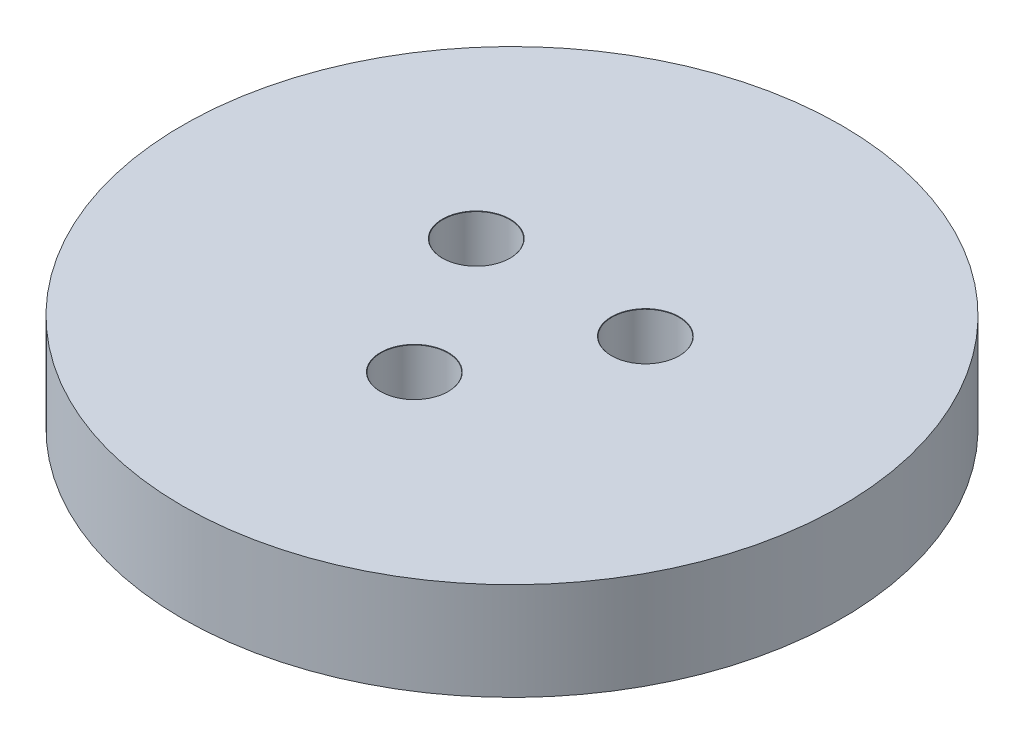
ISO-10303-21;
HEADER;
FILE_DESCRIPTION(('STEP AP214'),'2;1');
FILE_NAME('part.step','',(''),(''),'','','');
FILE_SCHEMA(('AUTOMOTIVE_DESIGN { 1 0 10303 214 1 1 1 1 }'));
ENDSEC;
DATA;
#1=APPLICATION_CONTEXT('core data for automotive mechanical design processes');
#2=APPLICATION_PROTOCOL_DEFINITION('international standard','automotive_design',2000,#1);
#3=PRODUCT_CONTEXT('',#1,'mechanical');
#4=PRODUCT('Part','Part','',(#3));
#5=PRODUCT_RELATED_PRODUCT_CATEGORY('part','',(#4));
#6=PRODUCT_DEFINITION_FORMATION('','',#4);
#7=PRODUCT_DEFINITION_CONTEXT('part definition',#1,'design');
#8=PRODUCT_DEFINITION('design','',#6,#7);
#9=PRODUCT_DEFINITION_SHAPE('','',#8);
#10=(LENGTH_UNIT() NAMED_UNIT(*) SI_UNIT(.MILLI.,.METRE.));
#11=(NAMED_UNIT(*) PLANE_ANGLE_UNIT() SI_UNIT($,.RADIAN.));
#12=(NAMED_UNIT(*) SI_UNIT($,.STERADIAN.) SOLID_ANGLE_UNIT());
#13=UNCERTAINTY_MEASURE_WITH_UNIT(LENGTH_MEASURE(1.E-05),#10,'distance_accuracy_value','');
#14=(GEOMETRIC_REPRESENTATION_CONTEXT(3) GLOBAL_UNCERTAINTY_ASSIGNED_CONTEXT((#13)) GLOBAL_UNIT_ASSIGNED_CONTEXT((#10,
#11,#12)) REPRESENTATION_CONTEXT('',''));
#15=CARTESIAN_POINT('',(0.,0.,0.));
#16=DIRECTION('',(0.,0.,1.));
#17=DIRECTION('',(1.,0.,0.));
#18=AXIS2_PLACEMENT_3D('',#15,#16,#17);
#19=CARTESIAN_POINT('',(0.,8.,0.));
#20=DIRECTION('',(0.,-1.,0.));
#21=DIRECTION('',(0.,0.,-1.));
#22=AXIS2_PLACEMENT_3D('',#19,#20,#21);
#23=CYLINDRICAL_SURFACE('',#22,27.);
#24=CARTESIAN_POINT('',(0.,8.,0.));
#25=DIRECTION('',(0.,1.,0.));
#26=DIRECTION('',(0.,0.,1.));
#27=AXIS2_PLACEMENT_3D('',#24,#25,#26);
#28=CIRCLE('',#27,27.);
#29=CARTESIAN_POINT('',(0.,8.,27.));
#30=VERTEX_POINT('',#29);
#31=EDGE_CURVE('E10',#30,#30,#28,.T.);
#32=ORIENTED_EDGE('',*,*,#31,.F.);
#33=EDGE_LOOP('',(#32));
#34=FACE_BOUND('',#33,.T.);
#35=CARTESIAN_POINT('',(0.,0.,0.));
#36=DIRECTION('',(0.,1.,0.));
#37=DIRECTION('',(0.,0.,1.));
#38=AXIS2_PLACEMENT_3D('',#35,#36,#37);
#39=CIRCLE('',#38,27.);
#40=CARTESIAN_POINT('',(0.,0.,27.));
#41=VERTEX_POINT('',#40);
#42=EDGE_CURVE('E40',#41,#41,#39,.T.);
#43=ORIENTED_EDGE('',*,*,#42,.T.);
#44=EDGE_LOOP('',(#43));
#45=FACE_BOUND('',#44,.T.);
#46=ADVANCED_FACE('F37',(#34,#45),#23,.T.);
#47=CARTESIAN_POINT('',(0.,8.,0.));
#48=DIRECTION('',(0.,1.,0.));
#49=DIRECTION('',(0.,0.,1.));
#50=AXIS2_PLACEMENT_3D('',#47,#48,#49);
#51=PLANE('',#50);
#52=CARTESIAN_POINT('',(-6.92820323027552,8.,-3.99999999999998));
#53=DIRECTION('',(0.,1.,0.));
#54=DIRECTION('',(0.,0.,1.));
#55=AXIS2_PLACEMENT_3D('',#52,#53,#54);
#56=CIRCLE('',#55,2.775);
#57=CARTESIAN_POINT('',(-6.92820323027552,8.,-1.22499999999998));
#58=VERTEX_POINT('',#57);
#59=EDGE_CURVE('E72',#58,#58,#56,.T.);
#60=ORIENTED_EDGE('',*,*,#59,.F.);
#61=EDGE_LOOP('',(#60));
#62=FACE_BOUND('',#61,.T.);
#63=CARTESIAN_POINT('',(6.92820323027549,8.,-4.00000000000004));
#64=DIRECTION('',(0.,1.,0.));
#65=DIRECTION('',(0.,0.,1.));
#66=AXIS2_PLACEMENT_3D('',#63,#64,#65);
#67=CIRCLE('',#66,2.775);
#68=CARTESIAN_POINT('',(6.92820323027549,8.,-1.22500000000004));
#69=VERTEX_POINT('',#68);
#70=EDGE_CURVE('E63',#69,#69,#67,.T.);
#71=ORIENTED_EDGE('',*,*,#70,.F.);
#72=EDGE_LOOP('',(#71));
#73=FACE_BOUND('',#72,.T.);
#74=CARTESIAN_POINT('',(0.,8.,8.));
#75=DIRECTION('',(0.,1.,0.));
#76=DIRECTION('',(0.,0.,1.));
#77=AXIS2_PLACEMENT_3D('',#74,#75,#76);
#78=CIRCLE('',#77,2.775);
#79=CARTESIAN_POINT('',(0.,8.,10.775));
#80=VERTEX_POINT('',#79);
#81=EDGE_CURVE('E54',#80,#80,#78,.T.);
#82=ORIENTED_EDGE('',*,*,#81,.F.);
#83=EDGE_LOOP('',(#82));
#84=FACE_BOUND('',#83,.T.);
#85=ORIENTED_EDGE('',*,*,#31,.T.);
#86=EDGE_LOOP('',(#85));
#87=FACE_BOUND('',#86,.T.);
#88=ADVANCED_FACE('F78',(#62,#73,#84,#87),#51,.T.);
#89=CARTESIAN_POINT('',(0.,0.,0.));
#90=DIRECTION('',(0.,1.,0.));
#91=DIRECTION('',(0.,0.,1.));
#92=AXIS2_PLACEMENT_3D('',#89,#90,#91);
#93=PLANE('',#92);
#94=CARTESIAN_POINT('',(-6.92820323027552,0.,-3.99999999999998));
#95=DIRECTION('',(0.,1.,0.));
#96=DIRECTION('',(0.,0.,1.));
#97=AXIS2_PLACEMENT_3D('',#94,#95,#96);
#98=CIRCLE('',#97,2.75);
#99=CARTESIAN_POINT('',(-6.92820323027552,0.,-1.24999999999998));
#100=VERTEX_POINT('',#99);
#101=EDGE_CURVE('E66',#100,#100,#98,.T.);
#102=ORIENTED_EDGE('',*,*,#101,.T.);
#103=EDGE_LOOP('',(#102));
#104=FACE_BOUND('',#103,.T.);
#105=CARTESIAN_POINT('',(6.92820323027549,0.,-4.00000000000004));
#106=DIRECTION('',(0.,1.,0.));
#107=DIRECTION('',(0.,0.,1.));
#108=AXIS2_PLACEMENT_3D('',#105,#106,#107);
#109=CIRCLE('',#108,2.75);
#110=CARTESIAN_POINT('',(6.92820323027549,0.,-1.25000000000004));
#111=VERTEX_POINT('',#110);
#112=EDGE_CURVE('E57',#111,#111,#109,.T.);
#113=ORIENTED_EDGE('',*,*,#112,.T.);
#114=EDGE_LOOP('',(#113));
#115=FACE_BOUND('',#114,.T.);
#116=CARTESIAN_POINT('',(0.,0.,8.));
#117=DIRECTION('',(0.,1.,0.));
#118=DIRECTION('',(0.,0.,1.));
#119=AXIS2_PLACEMENT_3D('',#116,#117,#118);
#120=CIRCLE('',#119,2.75);
#121=CARTESIAN_POINT('',(0.,0.,10.75));
#122=VERTEX_POINT('',#121);
#123=EDGE_CURVE('E47',#122,#122,#120,.T.);
#124=ORIENTED_EDGE('',*,*,#123,.T.);
#125=EDGE_LOOP('',(#124));
#126=FACE_BOUND('',#125,.T.);
#127=ORIENTED_EDGE('',*,*,#42,.F.);
#128=EDGE_LOOP('',(#127));
#129=FACE_BOUND('',#128,.T.);
#130=ADVANCED_FACE('F81',(#104,#115,#126,#129),#93,.F.);
#131=CARTESIAN_POINT('',(0.,8.,8.));
#132=DIRECTION('',(0.,1.,0.));
#133=DIRECTION('',(0.,0.,1.));
#134=AXIS2_PLACEMENT_3D('',#131,#132,#133);
#135=CYLINDRICAL_SURFACE('',#134,2.74999999999999);
#136=ORIENTED_EDGE('',*,*,#123,.F.);
#137=EDGE_LOOP('',(#136));
#138=FACE_BOUND('',#137,.T.);
#139=CARTESIAN_POINT('',(0.,7.97499999999999,8.));
#140=DIRECTION('',(0.,1.,0.));
#141=DIRECTION('',(0.,0.,1.));
#142=AXIS2_PLACEMENT_3D('',#139,#140,#141);
#143=CIRCLE('',#142,2.74999999999999);
#144=CARTESIAN_POINT('',(0.,7.97499999999999,10.75));
#145=VERTEX_POINT('',#144);
#146=EDGE_CURVE('E51',#145,#145,#143,.T.);
#147=ORIENTED_EDGE('',*,*,#146,.T.);
#148=EDGE_LOOP('',(#147));
#149=FACE_BOUND('',#148,.T.);
#150=ADVANCED_FACE('F90',(#138,#149),#135,.F.);
#151=CARTESIAN_POINT('',(0.,8.,8.));
#152=DIRECTION('',(0.,1.,0.));
#153=DIRECTION('',(0.,0.,1.));
#154=AXIS2_PLACEMENT_3D('',#151,#152,#153);
#155=CONICAL_SURFACE('',#154,2.775,0.785398163397474);
#156=ORIENTED_EDGE('',*,*,#146,.F.);
#157=EDGE_LOOP('',(#156));
#158=FACE_BOUND('',#157,.T.);
#159=ORIENTED_EDGE('',*,*,#81,.T.);
#160=EDGE_LOOP('',(#159));
#161=FACE_BOUND('',#160,.T.);
#162=ADVANCED_FACE('F87',(#158,#161),#155,.F.);
#163=CARTESIAN_POINT('',(6.92820323027549,8.,-4.00000000000004));
#164=DIRECTION('',(0.,1.,0.));
#165=DIRECTION('',(0.,0.,1.));
#166=AXIS2_PLACEMENT_3D('',#163,#164,#165);
#167=CYLINDRICAL_SURFACE('',#166,2.74999999999999);
#168=ORIENTED_EDGE('',*,*,#112,.F.);
#169=EDGE_LOOP('',(#168));
#170=FACE_BOUND('',#169,.T.);
#171=CARTESIAN_POINT('',(6.92820323027549,7.97499999999999,-4.00000000000004));
#172=DIRECTION('',(0.,1.,0.));
#173=DIRECTION('',(0.,0.,1.));
#174=AXIS2_PLACEMENT_3D('',#171,#172,#173);
#175=CIRCLE('',#174,2.74999999999999);
#176=CARTESIAN_POINT('',(6.92820323027549,7.97499999999999,-1.25000000000005));
#177=VERTEX_POINT('',#176);
#178=EDGE_CURVE('E60',#177,#177,#175,.T.);
#179=ORIENTED_EDGE('',*,*,#178,.T.);
#180=EDGE_LOOP('',(#179));
#181=FACE_BOUND('',#180,.T.);
#182=ADVANCED_FACE('F89',(#170,#181),#167,.F.);
#183=CARTESIAN_POINT('',(6.92820323027549,8.,-4.00000000000004));
#184=DIRECTION('',(0.,1.,0.));
#185=DIRECTION('',(0.,0.,1.));
#186=AXIS2_PLACEMENT_3D('',#183,#184,#185);
#187=CONICAL_SURFACE('',#186,2.775,0.785398163397448);
#188=ORIENTED_EDGE('',*,*,#178,.F.);
#189=EDGE_LOOP('',(#188));
#190=FACE_BOUND('',#189,.T.);
#191=ORIENTED_EDGE('',*,*,#70,.T.);
#192=EDGE_LOOP('',(#191));
#193=FACE_BOUND('',#192,.T.);
#194=ADVANCED_FACE('F97',(#190,#193),#187,.F.);
#195=CARTESIAN_POINT('',(-6.92820323027552,8.,-3.99999999999998));
#196=DIRECTION('',(0.,1.,0.));
#197=DIRECTION('',(0.,0.,1.));
#198=AXIS2_PLACEMENT_3D('',#195,#196,#197);
#199=CYLINDRICAL_SURFACE('',#198,2.74999999999999);
#200=ORIENTED_EDGE('',*,*,#101,.F.);
#201=EDGE_LOOP('',(#200));
#202=FACE_BOUND('',#201,.T.);
#203=CARTESIAN_POINT('',(-6.92820323027552,7.97499999999999,-3.99999999999998));
#204=DIRECTION('',(0.,1.,0.));
#205=DIRECTION('',(0.,0.,1.));
#206=AXIS2_PLACEMENT_3D('',#203,#204,#205);
#207=CIRCLE('',#206,2.74999999999999);
#208=CARTESIAN_POINT('',(-6.92820323027552,7.97499999999999,-1.24999999999999));
#209=VERTEX_POINT('',#208);
#210=EDGE_CURVE('E69',#209,#209,#207,.T.);
#211=ORIENTED_EDGE('',*,*,#210,.T.);
#212=EDGE_LOOP('',(#211));
#213=FACE_BOUND('',#212,.T.);
#214=ADVANCED_FACE('F125',(#202,#213),#199,.F.);
#215=CARTESIAN_POINT('',(-6.92820323027552,8.,-3.99999999999998));
#216=DIRECTION('',(0.,1.,0.));
#217=DIRECTION('',(0.,0.,1.));
#218=AXIS2_PLACEMENT_3D('',#215,#216,#217);
#219=CONICAL_SURFACE('',#218,2.775,0.785398163397466);
#220=ORIENTED_EDGE('',*,*,#210,.F.);
#221=EDGE_LOOP('',(#220));
#222=FACE_BOUND('',#221,.T.);
#223=ORIENTED_EDGE('',*,*,#59,.T.);
#224=EDGE_LOOP('',(#223));
#225=FACE_BOUND('',#224,.T.);
#226=ADVANCED_FACE('F76',(#222,#225),#219,.F.);
#227=CLOSED_SHELL('',(#46,#88,#130,#150,#162,#182,#194,#214,#226));
#228=MANIFOLD_SOLID_BREP('B2',#227);
#229=ADVANCED_BREP_SHAPE_REPRESENTATION('',(#18,#228),#14);
#230=SHAPE_DEFINITION_REPRESENTATION(#9,#229);
ENDSEC;
END-ISO-10303-21;
